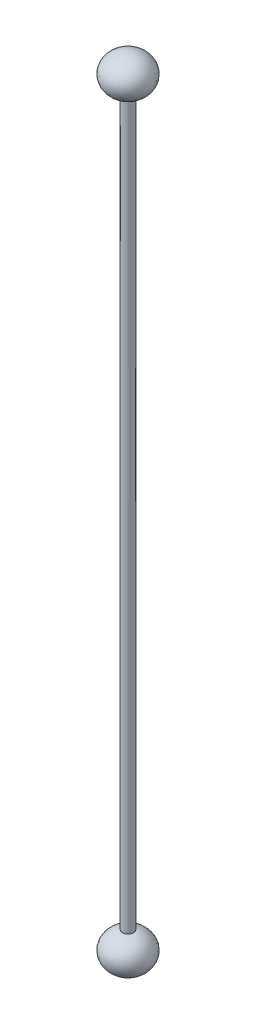
ISO-10303-21;
HEADER;
FILE_DESCRIPTION(('STEP AP214'),'2;1');
FILE_NAME('part.step','',(''),(''),'','','');
FILE_SCHEMA(('AUTOMOTIVE_DESIGN { 1 0 10303 214 1 1 1 1 }'));
ENDSEC;
DATA;
#1=APPLICATION_CONTEXT('core data for automotive mechanical design processes');
#2=APPLICATION_PROTOCOL_DEFINITION('international standard','automotive_design',2000,#1);
#3=PRODUCT_CONTEXT('',#1,'mechanical');
#4=PRODUCT('Part','Part','',(#3));
#5=PRODUCT_RELATED_PRODUCT_CATEGORY('part','',(#4));
#6=PRODUCT_DEFINITION_FORMATION('','',#4);
#7=PRODUCT_DEFINITION_CONTEXT('part definition',#1,'design');
#8=PRODUCT_DEFINITION('design','',#6,#7);
#9=PRODUCT_DEFINITION_SHAPE('','',#8);
#10=(LENGTH_UNIT() NAMED_UNIT(*) SI_UNIT(.MILLI.,.METRE.));
#11=(NAMED_UNIT(*) PLANE_ANGLE_UNIT() SI_UNIT($,.RADIAN.));
#12=(NAMED_UNIT(*) SI_UNIT($,.STERADIAN.) SOLID_ANGLE_UNIT());
#13=UNCERTAINTY_MEASURE_WITH_UNIT(LENGTH_MEASURE(1.E-05),#10,'distance_accuracy_value','');
#14=(GEOMETRIC_REPRESENTATION_CONTEXT(3) GLOBAL_UNCERTAINTY_ASSIGNED_CONTEXT((#13)) GLOBAL_UNIT_ASSIGNED_CONTEXT((#10,
#11,#12)) REPRESENTATION_CONTEXT('',''));
#15=CARTESIAN_POINT('',(0.,0.,0.));
#16=DIRECTION('',(0.,0.,1.));
#17=DIRECTION('',(1.,0.,0.));
#18=AXIS2_PLACEMENT_3D('',#15,#16,#17);
#19=CARTESIAN_POINT('',(0.,0.,0.));
#20=DIRECTION('',(0.,-1.,0.));
#21=DIRECTION('',(1.,0.,0.));
#22=AXIS2_PLACEMENT_3D('',#19,#20,#21);
#23=CYLINDRICAL_SURFACE('',#22,0.75000000000001);
#24=CARTESIAN_POINT('',(0.,2.42061459137964,0.));
#25=DIRECTION('',(0.,1.,0.));
#26=DIRECTION('',(-1.,0.,0.));
#27=AXIS2_PLACEMENT_3D('',#24,#25,#26);
#28=CIRCLE('',#27,0.75000000000001);
#29=CARTESIAN_POINT('',(-0.75000000000001,2.42061459137964,0.));
#30=VERTEX_POINT('',#29);
#31=EDGE_CURVE('E11',#30,#30,#28,.F.);
#32=ORIENTED_EDGE('',*,*,#31,.F.);
#33=EDGE_LOOP('',(#32));
#34=FACE_BOUND('',#33,.T.);
#35=CARTESIAN_POINT('',(0.,100.57938540862,0.));
#36=DIRECTION('',(0.,-1.,0.));
#37=DIRECTION('',(1.,0.,0.));
#38=AXIS2_PLACEMENT_3D('',#35,#36,#37);
#39=CIRCLE('',#38,0.750000000000018);
#40=CARTESIAN_POINT('',(0.749999999999999,100.57938540862,0.));
#41=VERTEX_POINT('',#40);
#42=EDGE_CURVE('E43',#41,#41,#39,.T.);
#43=ORIENTED_EDGE('',*,*,#42,.T.);
#44=EDGE_LOOP('',(#43));
#45=FACE_BOUND('',#44,.T.);
#46=ADVANCED_FACE('F36',(#34,#45),#23,.T.);
#47=CARTESIAN_POINT('',(0.,103.,0.));
#48=DIRECTION('',(0.,0.,1.));
#49=DIRECTION('',(1.,0.,0.));
#50=AXIS2_PLACEMENT_3D('',#47,#48,#49);
#51=ELLIPSE('',#50,3.00000000000002,2.5);
#52=TRIMMED_CURVE('',#51,(PARAMETER_VALUE(4.71238898038469)),
(PARAMETER_VALUE(7.85398163397448)),.T.,.PARAMETER.);
#53=CARTESIAN_POINT('',(0.,0.,0.));
#54=DIRECTION('',(0.,-1.,0.));
#55=AXIS1_PLACEMENT('',#53,#54);
#56=SURFACE_OF_REVOLUTION('',#52,#55);
#57=CARTESIAN_POINT('',(0.,105.5,0.));
#58=VERTEX_POINT('',#57);
#59=VERTEX_LOOP('',#58);
#60=FACE_BOUND('',#59,.T.);
#61=ORIENTED_EDGE('',*,*,#42,.F.);
#62=EDGE_LOOP('',(#61));
#63=FACE_BOUND('',#62,.T.);
#64=ADVANCED_FACE('F52',(#60,#63),#56,.F.);
#65=CARTESIAN_POINT('',(0.,0.,0.));
#66=DIRECTION('',(0.,0.,-1.));
#67=DIRECTION('',(1.,0.,0.));
#68=AXIS2_PLACEMENT_3D('',#65,#66,#67);
#69=ELLIPSE('',#68,3.00000000000002,2.5);
#70=TRIMMED_CURVE('',#69,(PARAMETER_VALUE(4.71238898038469)),
(PARAMETER_VALUE(7.85398163397448)),.T.,.PARAMETER.);
#71=CARTESIAN_POINT('',(0.,103.,0.));
#72=DIRECTION('',(0.,1.,0.));
#73=AXIS1_PLACEMENT('',#71,#72);
#74=SURFACE_OF_REVOLUTION('',#70,#73);
#75=CARTESIAN_POINT('',(0.,-2.5,0.));
#76=VERTEX_POINT('',#75);
#77=VERTEX_LOOP('',#76);
#78=FACE_BOUND('',#77,.T.);
#79=ORIENTED_EDGE('',*,*,#31,.T.);
#80=EDGE_LOOP('',(#79));
#81=FACE_BOUND('',#80,.T.);
#82=ADVANCED_FACE('F49',(#78,#81),#74,.F.);
#83=CLOSED_SHELL('',(#46,#64,#82));
#84=MANIFOLD_SOLID_BREP('B2',#83);
#85=ADVANCED_BREP_SHAPE_REPRESENTATION('',(#18,#84),#14);
#86=SHAPE_DEFINITION_REPRESENTATION(#9,#85);
ENDSEC;
END-ISO-10303-21;
